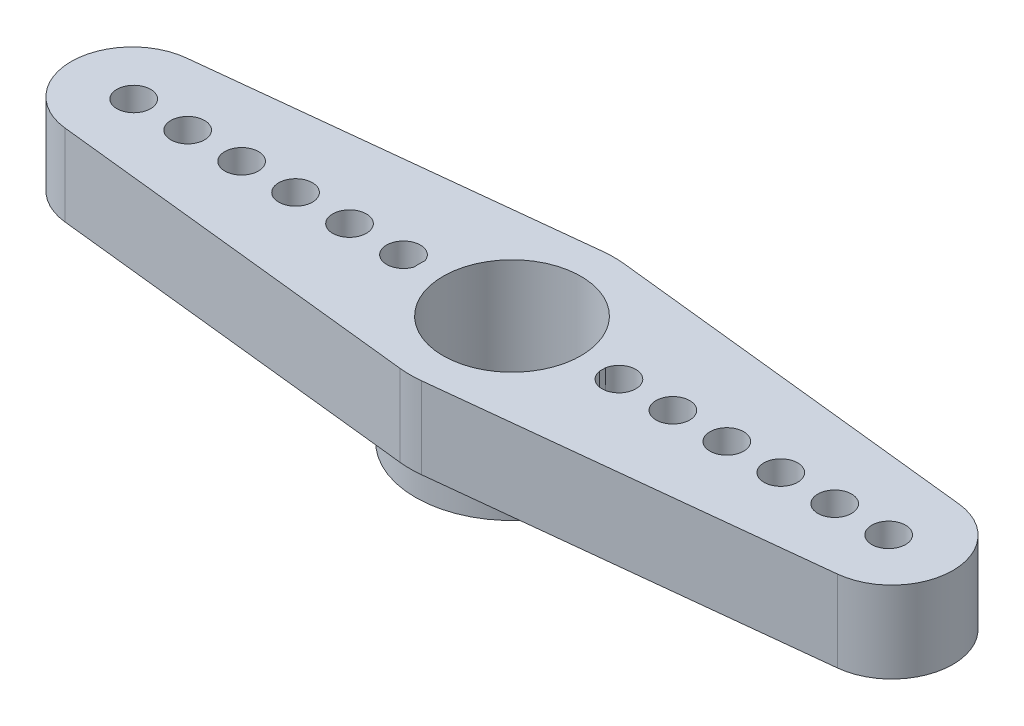
ISO-10303-21;
HEADER;
FILE_DESCRIPTION(('STEP AP214'),'2;1');
FILE_NAME('part.step','',(''),(''),'','','');
FILE_SCHEMA(('AUTOMOTIVE_DESIGN { 1 0 10303 214 1 1 1 1 }'));
ENDSEC;
DATA;
#1=APPLICATION_CONTEXT('core data for automotive mechanical design processes');
#2=APPLICATION_PROTOCOL_DEFINITION('international standard','automotive_design',2000,#1);
#3=PRODUCT_CONTEXT('',#1,'mechanical');
#4=PRODUCT('Part','Part','',(#3));
#5=PRODUCT_RELATED_PRODUCT_CATEGORY('part','',(#4));
#6=PRODUCT_DEFINITION_FORMATION('','',#4);
#7=PRODUCT_DEFINITION_CONTEXT('part definition',#1,'design');
#8=PRODUCT_DEFINITION('design','',#6,#7);
#9=PRODUCT_DEFINITION_SHAPE('','',#8);
#10=(LENGTH_UNIT() NAMED_UNIT(*) SI_UNIT(.MILLI.,.METRE.));
#11=(NAMED_UNIT(*) PLANE_ANGLE_UNIT() SI_UNIT($,.RADIAN.));
#12=(NAMED_UNIT(*) SI_UNIT($,.STERADIAN.) SOLID_ANGLE_UNIT());
#13=UNCERTAINTY_MEASURE_WITH_UNIT(LENGTH_MEASURE(1.E-05),#10,'distance_accuracy_value','');
#14=(GEOMETRIC_REPRESENTATION_CONTEXT(3) GLOBAL_UNCERTAINTY_ASSIGNED_CONTEXT((#13)) GLOBAL_UNIT_ASSIGNED_CONTEXT((#10,
#11,#12)) REPRESENTATION_CONTEXT('',''));
#15=CARTESIAN_POINT('',(0.,0.,0.));
#16=DIRECTION('',(0.,0.,1.));
#17=DIRECTION('',(1.,0.,0.));
#18=AXIS2_PLACEMENT_3D('',#15,#16,#17);
#19=CARTESIAN_POINT('',(-0.719755307054941,6.301994,-4.01353641249462));
#20=DIRECTION('',(0.,-1.,0.));
#21=DIRECTION('',(0.,0.,-1.));
#22=AXIS2_PLACEMENT_3D('',#19,#20,#21);
#23=CYLINDRICAL_SURFACE('',#22,3.3750823447217);
#24=CARTESIAN_POINT('',(-0.719755307054941,2.999994,-4.01353641249462));
#25=DIRECTION('',(0.,1.,0.));
#26=DIRECTION('',(0.,0.,1.));
#27=AXIS2_PLACEMENT_3D('',#24,#25,#26);
#28=CIRCLE('',#27,3.3750823447217);
#29=CARTESIAN_POINT('',(2.65230837761976,2.999994,-3.87082222206423));
#30=VERTEX_POINT('',#29);
#31=CARTESIAN_POINT('',(2.65458090260484,2.999994,-4.08450103629411));
#32=VERTEX_POINT('',#31);
#33=EDGE_CURVE('E165',#30,#32,#28,.T.);
#34=ORIENTED_EDGE('',*,*,#33,.F.);
#35=DIRECTION('',(0.,1.,0.));
#36=VECTOR('',#35,1.);
#37=CARTESIAN_POINT('',(2.65230837761976,-1.016,-3.87082222206425));
#38=LINE('',#37,#36);
#39=CARTESIAN_POINT('',(2.65230837761976,-1.016,-3.87082222206425));
#40=VERTEX_POINT('',#39);
#41=EDGE_CURVE('E67',#40,#30,#38,.T.);
#42=ORIENTED_EDGE('',*,*,#41,.F.);
#43=CARTESIAN_POINT('',(-0.719755307054941,-1.016,-4.01353641249462));
#44=DIRECTION('',(0.,1.,0.));
#45=DIRECTION('',(0.,0.,1.));
#46=AXIS2_PLACEMENT_3D('',#43,#44,#45);
#47=CIRCLE('',#46,3.3750823447217);
#48=CARTESIAN_POINT('',(2.65458090260484,-1.016,-4.0845010362941));
#49=VERTEX_POINT('',#48);
#50=EDGE_CURVE('E760',#49,#40,#47,.F.);
#51=ORIENTED_EDGE('',*,*,#50,.F.);
#52=DIRECTION('',(0.,1.,0.));
#53=VECTOR('',#52,1.);
#54=CARTESIAN_POINT('',(2.65458090260484,-1.016,-4.0845010362941));
#55=LINE('',#54,#53);
#56=EDGE_CURVE('E166',#49,#32,#55,.T.);
#57=ORIENTED_EDGE('',*,*,#56,.T.);
#58=EDGE_LOOP('',(#34,#42,#51,#57));
#59=FACE_BOUND('',#58,.T.);
#60=ADVANCED_FACE('F49',(#59),#23,.T.);
#61=CARTESIAN_POINT('',(-4.0906830412267,2.999994,-4.18094920962743));
#62=VERTEX_POINT('',#61);
#63=CARTESIAN_POINT('',(-4.08632212471416,2.999994,-3.77393529420009));
#64=VERTEX_POINT('',#63);
#65=EDGE_CURVE('E172',#62,#64,#28,.T.);
#66=ORIENTED_EDGE('',*,*,#65,.F.);
#67=DIRECTION('',(0.,1.,0.));
#68=VECTOR('',#67,1.);
#69=CARTESIAN_POINT('',(-4.0906830412267,-1.016,-4.18094920962742));
#70=LINE('',#69,#68);
#71=CARTESIAN_POINT('',(-4.0906830412267,-1.016,-4.18094920962742));
#72=VERTEX_POINT('',#71);
#73=EDGE_CURVE('E732',#72,#62,#70,.T.);
#74=ORIENTED_EDGE('',*,*,#73,.F.);
#75=CARTESIAN_POINT('',(-0.719755307054941,-1.016,-4.01353641249462));
#76=DIRECTION('',(0.,1.,0.));
#77=DIRECTION('',(0.,0.,1.));
#78=AXIS2_PLACEMENT_3D('',#75,#76,#77);
#79=CIRCLE('',#78,3.3750823447217);
#80=CARTESIAN_POINT('',(-4.08632212471416,-1.016,-3.77393529420009));
#81=VERTEX_POINT('',#80);
#82=EDGE_CURVE('E179',#81,#72,#79,.F.);
#83=ORIENTED_EDGE('',*,*,#82,.F.);
#84=DIRECTION('',(0.,1.,0.));
#85=VECTOR('',#84,1.);
#86=CARTESIAN_POINT('',(-4.08632212471416,-1.016,-3.77393529420009));
#87=LINE('',#86,#85);
#88=EDGE_CURVE('E736',#81,#64,#87,.T.);
#89=ORIENTED_EDGE('',*,*,#88,.T.);
#90=EDGE_LOOP('',(#66,#74,#83,#89));
#91=FACE_BOUND('',#90,.T.);
#92=ADVANCED_FACE('F368',(#91),#23,.T.);
#93=CARTESIAN_POINT('',(-0.719755533385708,0.,-4.03375521093414));
#94=DIRECTION('',(0.,-1.,0.));
#95=DIRECTION('',(0.,0.,-1.));
#96=AXIS2_PLACEMENT_3D('',#93,#94,#95);
#97=PLANE('',#96);
#98=CARTESIAN_POINT('',(-8.65322302171259,0.,-3.970614789235));
#99=DIRECTION('',(0.,-1.,0.));
#100=DIRECTION('',(0.,0.,-1.));
#101=AXIS2_PLACEMENT_3D('',#98,#99,#100);
#102=CIRCLE('',#101,0.621776251999999);
#103=CARTESIAN_POINT('',(-8.65322302171259,0.,-4.592391041235));
#104=VERTEX_POINT('',#103);
#105=EDGE_CURVE('E53',#104,#104,#102,.T.);
#106=ORIENTED_EDGE('',*,*,#105,.F.);
#107=EDGE_LOOP('',(#106));
#108=FACE_BOUND('',#107,.T.);
#109=CARTESIAN_POINT('',(-10.6418375357126,0.,-3.97061478923498));
#110=DIRECTION('',(0.,-1.,0.));
#111=DIRECTION('',(0.,0.,-1.));
#112=AXIS2_PLACEMENT_3D('',#109,#110,#111);
#113=CIRCLE('',#112,0.621776251999999);
#114=CARTESIAN_POINT('',(-10.6418375357126,0.,-4.59239104123498));
#115=VERTEX_POINT('',#114);
#116=EDGE_CURVE('E234',#115,#115,#113,.T.);
#117=ORIENTED_EDGE('',*,*,#116,.F.);
#118=EDGE_LOOP('',(#117));
#119=FACE_BOUND('',#118,.T.);
#120=CARTESIAN_POINT('',(-12.6304520497126,0.,-3.97061478923497));
#121=DIRECTION('',(0.,-1.,0.));
#122=DIRECTION('',(0.,0.,-1.));
#123=AXIS2_PLACEMENT_3D('',#120,#121,#122);
#124=CIRCLE('',#123,0.621776251999999);
#125=CARTESIAN_POINT('',(-12.6304520497126,0.,-4.59239104123497));
#126=VERTEX_POINT('',#125);
#127=EDGE_CURVE('E229',#126,#126,#124,.T.);
#128=ORIENTED_EDGE('',*,*,#127,.F.);
#129=EDGE_LOOP('',(#128));
#130=FACE_BOUND('',#129,.T.);
#131=CARTESIAN_POINT('',(-14.6190665637126,0.,-3.97061478923496));
#132=DIRECTION('',(0.,-1.,0.));
#133=DIRECTION('',(0.,0.,-1.));
#134=AXIS2_PLACEMENT_3D('',#131,#132,#133);
#135=CIRCLE('',#134,0.621776251999999);
#136=CARTESIAN_POINT('',(-14.6190665637126,0.,-4.59239104123496));
#137=VERTEX_POINT('',#136);
#138=EDGE_CURVE('E224',#137,#137,#135,.T.);
#139=ORIENTED_EDGE('',*,*,#138,.F.);
#140=EDGE_LOOP('',(#139));
#141=FACE_BOUND('',#140,.T.);
#142=CARTESIAN_POINT('',(7.24316630490026,0.,-3.970614789235));
#143=DIRECTION('',(0.,-1.,0.));
#144=DIRECTION('',(0.,0.,-1.));
#145=AXIS2_PLACEMENT_3D('',#142,#143,#144);
#146=CIRCLE('',#145,0.621776252000001);
#147=CARTESIAN_POINT('',(7.24316630490026,0.,-4.592391041235));
#148=VERTEX_POINT('',#147);
#149=EDGE_CURVE('E214',#148,#148,#146,.F.);
#150=ORIENTED_EDGE('',*,*,#149,.T.);
#151=EDGE_LOOP('',(#150));
#152=FACE_BOUND('',#151,.T.);
#153=CARTESIAN_POINT('',(11.2203953329003,0.,-3.97061478923497));
#154=DIRECTION('',(0.,-1.,0.));
#155=DIRECTION('',(0.,0.,-1.));
#156=AXIS2_PLACEMENT_3D('',#153,#154,#155);
#157=CIRCLE('',#156,0.621776251999999);
#158=CARTESIAN_POINT('',(11.2203953329003,0.,-4.59239104123497));
#159=VERTEX_POINT('',#158);
#160=EDGE_CURVE('E204',#159,#159,#157,.F.);
#161=ORIENTED_EDGE('',*,*,#160,.T.);
#162=EDGE_LOOP('',(#161));
#163=FACE_BOUND('',#162,.T.);
#164=CARTESIAN_POINT('',(-0.719755533385708,0.,-4.03375521093414));
#165=DIRECTION('',(0.,1.,0.));
#166=DIRECTION('',(0.,0.,-1.));
#167=AXIS2_PLACEMENT_3D('',#164,#165,#166);
#168=CIRCLE('',#167,3.73659729971613);
#169=CARTESIAN_POINT('',(-0.317978333385708,0.,-7.74868918905623));
#170=VERTEX_POINT('',#169);
#171=CARTESIAN_POINT('',(-1.12153273338571,0.,-7.74868918905623));
#172=VERTEX_POINT('',#171);
#173=EDGE_CURVE('E280',#170,#172,#168,.T.);
#174=ORIENTED_EDGE('',*,*,#173,.F.);
#175=DIRECTION('',(-0.994202393285548,0.,-0.107524886353294));
#176=VECTOR('',#175,1.);
#177=CARTESIAN_POINT('',(13.5213132666143,0.,-6.25194338905623));
#178=LINE('',#177,#176);
#179=CARTESIAN_POINT('',(13.5213132666143,0.,-6.25194338905623));
#180=VERTEX_POINT('',#179);
#181=EDGE_CURVE('E258',#180,#170,#178,.T.);
#182=ORIENTED_EDGE('',*,*,#181,.F.);
#183=CARTESIAN_POINT('',(13.2802404727299,0.,-4.01488918905623));
#184=DIRECTION('',(0.,1.,0.));
#185=DIRECTION('',(0.,0.,-1.));
#186=AXIS2_PLACEMENT_3D('',#183,#184,#185);
#187=CIRCLE('',#186,2.25000613014473);
#188=CARTESIAN_POINT('',(13.5213132666143,0.,-1.77783498905622));
#189=VERTEX_POINT('',#188);
#190=EDGE_CURVE('E299',#189,#180,#187,.T.);
#191=ORIENTED_EDGE('',*,*,#190,.F.);
#192=DIRECTION('',(0.994202393285548,0.,-0.107524886353294));
#193=VECTOR('',#192,1.);
#194=CARTESIAN_POINT('',(13.5213132666143,0.,-1.77783498905622));
#195=LINE('',#194,#193);
#196=CARTESIAN_POINT('',(-0.317978333385709,0.,-0.281089189056225));
#197=VERTEX_POINT('',#196);
#198=EDGE_CURVE('E296',#197,#189,#195,.T.);
#199=ORIENTED_EDGE('',*,*,#198,.F.);
#200=CARTESIAN_POINT('',(-0.719755533385708,0.,-3.99602316717831));
#201=DIRECTION('',(0.,1.,0.));
#202=DIRECTION('',(0.,0.,1.));
#203=AXIS2_PLACEMENT_3D('',#200,#201,#202);
#204=CIRCLE('',#203,3.73659729971613);
#205=CARTESIAN_POINT('',(-1.12153273338571,0.,-0.281089189056225));
#206=VERTEX_POINT('',#205);
#207=EDGE_CURVE('E293',#206,#197,#204,.T.);
#208=ORIENTED_EDGE('',*,*,#207,.F.);
#209=DIRECTION('',(0.994202393285548,0.,0.107524886353294));
#210=VECTOR('',#209,1.);
#211=CARTESIAN_POINT('',(-14.9608243333857,0.,-1.77783498905622));
#212=LINE('',#211,#210);
#213=CARTESIAN_POINT('',(-14.9608243333857,0.,-1.77783498905623));
#214=VERTEX_POINT('',#213);
#215=EDGE_CURVE('E290',#214,#206,#212,.T.);
#216=ORIENTED_EDGE('',*,*,#215,.F.);
#217=CARTESIAN_POINT('',(-14.7197515395013,0.,-4.01488918905623));
#218=DIRECTION('',(0.,1.,0.));
#219=DIRECTION('',(0.,0.,1.));
#220=AXIS2_PLACEMENT_3D('',#217,#218,#219);
#221=CIRCLE('',#220,2.25000613014473);
#222=CARTESIAN_POINT('',(-14.9608243333857,0.,-6.25194338905623));
#223=VERTEX_POINT('',#222);
#224=EDGE_CURVE('E287',#223,#214,#221,.T.);
#225=ORIENTED_EDGE('',*,*,#224,.F.);
#226=DIRECTION('',(-0.994202393285548,0.,0.107524886353294));
#227=VECTOR('',#226,1.);
#228=CARTESIAN_POINT('',(-14.9608243333857,0.,-6.25194338905623));
#229=LINE('',#228,#227);
#230=EDGE_CURVE('E284',#172,#223,#229,.T.);
#231=ORIENTED_EDGE('',*,*,#230,.F.);
#232=EDGE_LOOP('',(#174,#182,#191,#199,#208,#216,#225,#231));
#233=FACE_BOUND('',#232,.T.);
#234=CARTESIAN_POINT('',(-6.66460850771259,0.,-3.97061478923501));
#235=DIRECTION('',(0.,-1.,0.));
#236=DIRECTION('',(0.,0.,-1.));
#237=AXIS2_PLACEMENT_3D('',#234,#235,#236);
#238=CIRCLE('',#237,0.621776251999999);
#239=CARTESIAN_POINT('',(-6.66460850771259,0.,-4.59239104123501));
#240=VERTEX_POINT('',#239);
#241=EDGE_CURVE('E184',#240,#240,#238,.T.);
#242=ORIENTED_EDGE('',*,*,#241,.F.);
#243=EDGE_LOOP('',(#242));
#244=FACE_BOUND('',#243,.T.);
#245=CARTESIAN_POINT('',(9.23178081890026,0.,-3.97061478923498));
#246=DIRECTION('',(0.,-1.,0.));
#247=DIRECTION('',(0.,0.,-1.));
#248=AXIS2_PLACEMENT_3D('',#245,#246,#247);
#249=CIRCLE('',#248,0.621776251999999);
#250=CARTESIAN_POINT('',(9.23178081890026,0.,-4.59239104123498));
#251=VERTEX_POINT('',#250);
#252=EDGE_CURVE('E199',#251,#251,#249,.F.);
#253=ORIENTED_EDGE('',*,*,#252,.T.);
#254=EDGE_LOOP('',(#253));
#255=FACE_BOUND('',#254,.T.);
#256=CARTESIAN_POINT('',(13.2090098469003,0.,-3.97061478923496));
#257=DIRECTION('',(0.,-1.,0.));
#258=DIRECTION('',(0.,0.,-1.));
#259=AXIS2_PLACEMENT_3D('',#256,#257,#258);
#260=CIRCLE('',#259,0.621776251999999);
#261=CARTESIAN_POINT('',(13.2090098469003,0.,-4.59239104123496));
#262=VERTEX_POINT('',#261);
#263=EDGE_CURVE('E209',#262,#262,#260,.F.);
#264=ORIENTED_EDGE('',*,*,#263,.T.);
#265=EDGE_LOOP('',(#264));
#266=FACE_BOUND('',#265,.T.);
#267=CARTESIAN_POINT('',(5.25455179090026,0.,-3.97061478923501));
#268=DIRECTION('',(0.,-1.,0.));
#269=DIRECTION('',(0.,0.,-1.));
#270=AXIS2_PLACEMENT_3D('',#267,#268,#269);
#271=CIRCLE('',#270,0.621776251999999);
#272=CARTESIAN_POINT('',(5.25455179090026,0.,-4.59239104123501));
#273=VERTEX_POINT('',#272);
#274=EDGE_CURVE('E219',#273,#273,#271,.F.);
#275=ORIENTED_EDGE('',*,*,#274,.T.);
#276=EDGE_LOOP('',(#275));
#277=FACE_BOUND('',#276,.T.);
#278=CARTESIAN_POINT('',(-0.719799300150664,0.,-4.01491224896464));
#279=DIRECTION('',(0.,-1.,0.));
#280=DIRECTION('',(0.,0.,-1.));
#281=AXIS2_PLACEMENT_3D('',#278,#279,#280);
#282=CIRCLE('',#281,3.556);
#283=CARTESIAN_POINT('',(2.8060339474114,0.,-3.55270460040617));
#284=VERTEX_POINT('',#283);
#285=CARTESIAN_POINT('',(-4.24201186821214,0.,-3.52587786838415));
#286=VERTEX_POINT('',#285);
#287=EDGE_CURVE('E249',#284,#286,#282,.T.);
#288=ORIENTED_EDGE('',*,*,#287,.F.);
#289=CARTESIAN_POINT('',(3.26593735458067,0.,-3.97114762355899));
#290=DIRECTION('',(0.,-1.,0.));
#291=DIRECTION('',(0.,0.,-1.));
#292=AXIS2_PLACEMENT_3D('',#289,#290,#291);
#293=CIRCLE('',#292,0.621776251999999);
#294=CARTESIAN_POINT('',(2.81533299330576,0.,-4.39958830457703));
#295=VERTEX_POINT('',#294);
#296=EDGE_CURVE('E192',#284,#295,#293,.F.);
#297=ORIENTED_EDGE('',*,*,#296,.T.);
#298=CARTESIAN_POINT('',(-4.25196828447618,0.,-4.42590892312256));
#299=VERTEX_POINT('',#298);
#300=EDGE_CURVE('E243',#299,#295,#282,.T.);
#301=ORIENTED_EDGE('',*,*,#300,.F.);
#302=CARTESIAN_POINT('',(-4.67599407139299,0.,-3.97114762355899));
#303=DIRECTION('',(0.,-1.,0.));
#304=DIRECTION('',(0.,0.,-1.));
#305=AXIS2_PLACEMENT_3D('',#302,#303,#304);
#306=CIRCLE('',#305,0.621776252);
#307=EDGE_CURVE('E395',#286,#299,#306,.T.);
#308=ORIENTED_EDGE('',*,*,#307,.F.);
#309=EDGE_LOOP('',(#288,#297,#301,#308));
#310=FACE_BOUND('',#309,.T.);
#311=ADVANCED_FACE('F364',(#108,#119,#130,#141,#152,#163,#233,#244,#255,#266,#277,#310),#97,.T.);
#312=CARTESIAN_POINT('',(-0.719799300150664,-1.016,-4.01491224896464));
#313=DIRECTION('',(0.,1.,0.));
#314=DIRECTION('',(0.,0.,1.));
#315=AXIS2_PLACEMENT_3D('',#312,#313,#314);
#316=CYLINDRICAL_SURFACE('',#315,3.556);
#317=DIRECTION('',(0.,1.,0.));
#318=VECTOR('',#317,1.);
#319=CARTESIAN_POINT('',(2.81533299330576,2.642997,-4.39958830457703));
#320=LINE('',#319,#318);
#321=CARTESIAN_POINT('',(2.81533299330576,-1.016,-4.39958830457703));
#322=VERTEX_POINT('',#321);
#323=EDGE_CURVE('E185',#322,#295,#320,.T.);
#324=ORIENTED_EDGE('',*,*,#323,.F.);
#325=CARTESIAN_POINT('',(-0.719799300150664,-1.016,-4.01491224896464));
#326=DIRECTION('',(0.,-1.,0.));
#327=DIRECTION('',(0.,0.,-1.));
#328=AXIS2_PLACEMENT_3D('',#325,#326,#327);
#329=CIRCLE('',#328,3.556);
#330=CARTESIAN_POINT('',(-4.25196828447618,-1.016,-4.42590892312256));
#331=VERTEX_POINT('',#330);
#332=EDGE_CURVE('E244',#331,#322,#329,.T.);
#333=ORIENTED_EDGE('',*,*,#332,.F.);
#334=DIRECTION('',(0.,1.,0.));
#335=VECTOR('',#334,1.);
#336=CARTESIAN_POINT('',(-4.25196828447618,2.642997,-4.42590892312256));
#337=LINE('',#336,#335);
#338=EDGE_CURVE('E75',#331,#299,#337,.T.);
#339=ORIENTED_EDGE('',*,*,#338,.T.);
#340=ORIENTED_EDGE('',*,*,#300,.T.);
#341=EDGE_LOOP('',(#324,#333,#339,#340));
#342=FACE_BOUND('',#341,.T.);
#343=ADVANCED_FACE('F367',(#342),#316,.T.);
#344=DIRECTION('',(0.,1.,0.));
#345=VECTOR('',#344,1.);
#346=CARTESIAN_POINT('',(2.8060339474114,2.642997,-3.55270460040617));
#347=LINE('',#346,#345);
#348=CARTESIAN_POINT('',(2.8060339474114,-1.016,-3.55270460040617));
#349=VERTEX_POINT('',#348);
#350=EDGE_CURVE('E755',#284,#349,#347,.F.);
#351=ORIENTED_EDGE('',*,*,#350,.F.);
#352=ORIENTED_EDGE('',*,*,#287,.T.);
#353=DIRECTION('',(0.,1.,0.));
#354=VECTOR('',#353,1.);
#355=CARTESIAN_POINT('',(-4.24201186821214,2.642997,-3.52587786838415));
#356=LINE('',#355,#354);
#357=CARTESIAN_POINT('',(-4.24201186821214,-1.016,-3.52587786838415));
#358=VERTEX_POINT('',#357);
#359=EDGE_CURVE('E748',#286,#358,#356,.F.);
#360=ORIENTED_EDGE('',*,*,#359,.T.);
#361=EDGE_CURVE('E248',#349,#358,#329,.T.);
#362=ORIENTED_EDGE('',*,*,#361,.F.);
#363=EDGE_LOOP('',(#351,#352,#360,#362));
#364=FACE_BOUND('',#363,.T.);
#365=ADVANCED_FACE('F512',(#364),#316,.T.);
#366=CARTESIAN_POINT('',(0.,-1.016,0.));
#367=DIRECTION('',(0.,-1.,0.));
#368=DIRECTION('',(0.,0.,-1.));
#369=AXIS2_PLACEMENT_3D('',#366,#367,#368);
#370=PLANE('',#369);
#371=CARTESIAN_POINT('',(-0.719799300150664,-1.016,-4.01491224896464));
#372=DIRECTION('',(0.,1.,0.));
#373=DIRECTION('',(0.,0.,1.));
#374=AXIS2_PLACEMENT_3D('',#371,#372,#373);
#375=CIRCLE('',#374,2.54);
#376=CARTESIAN_POINT('',(-0.719799300150664,-1.016,-1.47491224896464));
#377=VERTEX_POINT('',#376);
#378=EDGE_CURVE('E764',#377,#377,#375,.T.);
#379=ORIENTED_EDGE('',*,*,#378,.T.);
#380=EDGE_LOOP('',(#379));
#381=FACE_BOUND('',#380,.T.);
#382=ORIENTED_EDGE('',*,*,#50,.T.);
#383=CARTESIAN_POINT('',(3.26593735458067,-1.016,-3.97114762355899));
#384=DIRECTION('',(0.,-1.,0.));
#385=DIRECTION('',(0.,0.,-1.));
#386=AXIS2_PLACEMENT_3D('',#383,#384,#385);
#387=CIRCLE('',#386,0.621776251999999);
#388=EDGE_CURVE('E12',#40,#349,#387,.F.);
#389=ORIENTED_EDGE('',*,*,#388,.T.);
#390=ORIENTED_EDGE('',*,*,#361,.T.);
#391=CARTESIAN_POINT('',(-4.67599407139299,-1.016,-3.97114762355899));
#392=DIRECTION('',(0.,-1.,0.));
#393=DIRECTION('',(0.,0.,-1.));
#394=AXIS2_PLACEMENT_3D('',#391,#392,#393);
#395=CIRCLE('',#394,0.621776252);
#396=EDGE_CURVE('E59',#81,#358,#395,.T.);
#397=ORIENTED_EDGE('',*,*,#396,.F.);
#398=ORIENTED_EDGE('',*,*,#82,.T.);
#399=CARTESIAN_POINT('',(-4.67599407139299,-1.016,-3.97114762355899));
#400=DIRECTION('',(0.,1.,0.));
#401=DIRECTION('',(0.,0.,1.));
#402=AXIS2_PLACEMENT_3D('',#399,#400,#401);
#403=CIRCLE('',#402,0.621776252);
#404=EDGE_CURVE('E727',#72,#331,#403,.T.);
#405=ORIENTED_EDGE('',*,*,#404,.T.);
#406=ORIENTED_EDGE('',*,*,#332,.T.);
#407=CARTESIAN_POINT('',(3.26593735458067,-1.016,-3.97114762355899));
#408=DIRECTION('',(0.,1.,0.));
#409=DIRECTION('',(0.,0.,1.));
#410=AXIS2_PLACEMENT_3D('',#407,#408,#409);
#411=CIRCLE('',#410,0.621776251999999);
#412=EDGE_CURVE('E171',#49,#322,#411,.F.);
#413=ORIENTED_EDGE('',*,*,#412,.F.);
#414=EDGE_LOOP('',(#382,#389,#390,#397,#398,#405,#406,#413));
#415=FACE_BOUND('',#414,.T.);
#416=ADVANCED_FACE('F489',(#381,#415),#370,.T.);
#417=CARTESIAN_POINT('',(-0.719755533385708,2.999994,-4.03375521093414));
#418=DIRECTION('',(0.,-1.,0.));
#419=DIRECTION('',(0.,0.,-1.));
#420=AXIS2_PLACEMENT_3D('',#417,#418,#419);
#421=CYLINDRICAL_SURFACE('',#420,3.73659729971613);
#422=ORIENTED_EDGE('',*,*,#173,.T.);
#423=DIRECTION('',(0.,-1.,0.));
#424=VECTOR('',#423,1.);
#425=CARTESIAN_POINT('',(-1.12153273338571,2.999994,-7.74868918905623));
#426=LINE('',#425,#424);
#427=CARTESIAN_POINT('',(-1.12153273338571,2.999994,-7.74868918905623));
#428=VERTEX_POINT('',#427);
#429=EDGE_CURVE('E331',#428,#172,#426,.T.);
#430=ORIENTED_EDGE('',*,*,#429,.F.);
#431=CARTESIAN_POINT('',(-0.719755533385708,2.999994,-4.03375521093414));
#432=DIRECTION('',(0.,1.,0.));
#433=DIRECTION('',(0.,0.,-1.));
#434=AXIS2_PLACEMENT_3D('',#431,#432,#433);
#435=CIRCLE('',#434,3.73659729971613);
#436=CARTESIAN_POINT('',(-0.317978333385708,2.999994,-7.74868918905623));
#437=VERTEX_POINT('',#436);
#438=EDGE_CURVE('E253',#437,#428,#435,.T.);
#439=ORIENTED_EDGE('',*,*,#438,.F.);
#440=DIRECTION('',(0.,-1.,0.));
#441=VECTOR('',#440,1.);
#442=CARTESIAN_POINT('',(-0.317978333385708,2.999994,-7.74868918905623));
#443=LINE('',#442,#441);
#444=EDGE_CURVE('E279',#437,#170,#443,.T.);
#445=ORIENTED_EDGE('',*,*,#444,.T.);
#446=EDGE_LOOP('',(#422,#430,#439,#445));
#447=FACE_BOUND('',#446,.T.);
#448=ADVANCED_FACE('F51',(#447),#421,.T.);
#449=CARTESIAN_POINT('',(-14.9608243333857,2.999994,-6.25194338905623));
#450=DIRECTION('',(0.107524886353294,0.,0.994202393285548));
#451=DIRECTION('',(0.994202393285548,0.,-0.107524886353294));
#452=AXIS2_PLACEMENT_3D('',#449,#450,#451);
#453=PLANE('',#452);
#454=ORIENTED_EDGE('',*,*,#230,.T.);
#455=DIRECTION('',(0.,-1.,0.));
#456=VECTOR('',#455,1.);
#457=CARTESIAN_POINT('',(-14.9608243333857,2.999994,-6.25194338905623));
#458=LINE('',#457,#456);
#459=CARTESIAN_POINT('',(-14.9608243333857,2.999994,-6.25194338905623));
#460=VERTEX_POINT('',#459);
#461=EDGE_CURVE('E327',#460,#223,#458,.T.);
#462=ORIENTED_EDGE('',*,*,#461,.F.);
#463=DIRECTION('',(-0.994202393285548,0.,0.107524886353294));
#464=VECTOR('',#463,1.);
#465=CARTESIAN_POINT('',(-14.9608243333857,2.999994,-6.25194338905623));
#466=LINE('',#465,#464);
#467=EDGE_CURVE('E257',#428,#460,#466,.T.);
#468=ORIENTED_EDGE('',*,*,#467,.F.);
#469=ORIENTED_EDGE('',*,*,#429,.T.);
#470=EDGE_LOOP('',(#454,#462,#468,#469));
#471=FACE_BOUND('',#470,.T.);
#472=ADVANCED_FACE('F482',(#471),#453,.F.);
#473=CARTESIAN_POINT('',(-14.7197515395013,2.999994,-4.01488918905623));
#474=DIRECTION('',(0.,-1.,0.));
#475=DIRECTION('',(0.,0.,-1.));
#476=AXIS2_PLACEMENT_3D('',#473,#474,#475);
#477=CYLINDRICAL_SURFACE('',#476,2.25000613014473);
#478=ORIENTED_EDGE('',*,*,#224,.T.);
#479=DIRECTION('',(0.,-1.,0.));
#480=VECTOR('',#479,1.);
#481=CARTESIAN_POINT('',(-14.9608243333857,2.999994,-1.77783498905623));
#482=LINE('',#481,#480);
#483=CARTESIAN_POINT('',(-14.9608243333857,2.999994,-1.77783498905623));
#484=VERTEX_POINT('',#483);
#485=EDGE_CURVE('E323',#484,#214,#482,.T.);
#486=ORIENTED_EDGE('',*,*,#485,.F.);
#487=CARTESIAN_POINT('',(-14.7197515395013,2.999994,-4.01488918905623));
#488=DIRECTION('',(0.,1.,0.));
#489=DIRECTION('',(0.,0.,1.));
#490=AXIS2_PLACEMENT_3D('',#487,#488,#489);
#491=CIRCLE('',#490,2.25000613014473);
#492=EDGE_CURVE('E261',#460,#484,#491,.T.);
#493=ORIENTED_EDGE('',*,*,#492,.F.);
#494=ORIENTED_EDGE('',*,*,#461,.T.);
#495=EDGE_LOOP('',(#478,#486,#493,#494));
#496=FACE_BOUND('',#495,.T.);
#497=ADVANCED_FACE('F479',(#496),#477,.T.);
#498=CARTESIAN_POINT('',(-14.9608243333857,2.999994,-1.77783498905622));
#499=DIRECTION('',(0.107524886353294,0.,-0.994202393285548));
#500=DIRECTION('',(-0.994202393285548,0.,-0.107524886353294));
#501=AXIS2_PLACEMENT_3D('',#498,#499,#500);
#502=PLANE('',#501);
#503=ORIENTED_EDGE('',*,*,#215,.T.);
#504=DIRECTION('',(0.,-1.,0.));
#505=VECTOR('',#504,1.);
#506=CARTESIAN_POINT('',(-1.12153273338571,2.999994,-0.281089189056225));
#507=LINE('',#506,#505);
#508=CARTESIAN_POINT('',(-1.12153273338571,2.999994,-0.281089189056225));
#509=VERTEX_POINT('',#508);
#510=EDGE_CURVE('E319',#509,#206,#507,.T.);
#511=ORIENTED_EDGE('',*,*,#510,.F.);
#512=DIRECTION('',(0.994202393285548,0.,0.107524886353294));
#513=VECTOR('',#512,1.);
#514=CARTESIAN_POINT('',(-14.9608243333857,2.999994,-1.77783498905622));
#515=LINE('',#514,#513);
#516=EDGE_CURVE('E264',#484,#509,#515,.T.);
#517=ORIENTED_EDGE('',*,*,#516,.F.);
#518=ORIENTED_EDGE('',*,*,#485,.T.);
#519=EDGE_LOOP('',(#503,#511,#517,#518));
#520=FACE_BOUND('',#519,.T.);
#521=ADVANCED_FACE('F475',(#520),#502,.F.);
#522=CARTESIAN_POINT('',(-0.719755533385708,2.999994,-3.99602316717831));
#523=DIRECTION('',(0.,-1.,0.));
#524=DIRECTION('',(0.,0.,-1.));
#525=AXIS2_PLACEMENT_3D('',#522,#523,#524);
#526=CYLINDRICAL_SURFACE('',#525,3.73659729971613);
#527=ORIENTED_EDGE('',*,*,#207,.T.);
#528=DIRECTION('',(0.,-1.,0.));
#529=VECTOR('',#528,1.);
#530=CARTESIAN_POINT('',(-0.317978333385709,2.999994,-0.281089189056225));
#531=LINE('',#530,#529);
#532=CARTESIAN_POINT('',(-0.317978333385709,2.999994,-0.281089189056225));
#533=VERTEX_POINT('',#532);
#534=EDGE_CURVE('E315',#533,#197,#531,.T.);
#535=ORIENTED_EDGE('',*,*,#534,.F.);
#536=CARTESIAN_POINT('',(-0.719755533385708,2.999994,-3.99602316717831));
#537=DIRECTION('',(0.,1.,0.));
#538=DIRECTION('',(0.,0.,1.));
#539=AXIS2_PLACEMENT_3D('',#536,#537,#538);
#540=CIRCLE('',#539,3.73659729971613);
#541=EDGE_CURVE('E267',#509,#533,#540,.T.);
#542=ORIENTED_EDGE('',*,*,#541,.F.);
#543=ORIENTED_EDGE('',*,*,#510,.T.);
#544=EDGE_LOOP('',(#527,#535,#542,#543));
#545=FACE_BOUND('',#544,.T.);
#546=ADVANCED_FACE('F471',(#545),#526,.T.);
#547=CARTESIAN_POINT('',(13.5213132666143,2.999994,-1.77783498905622));
#548=DIRECTION('',(-0.107524886353294,0.,-0.994202393285548));
#549=DIRECTION('',(-0.994202393285548,0.,0.107524886353294));
#550=AXIS2_PLACEMENT_3D('',#547,#548,#549);
#551=PLANE('',#550);
#552=ORIENTED_EDGE('',*,*,#198,.T.);
#553=DIRECTION('',(0.,-1.,0.));
#554=VECTOR('',#553,1.);
#555=CARTESIAN_POINT('',(13.5213132666143,2.999994,-1.77783498905622));
#556=LINE('',#555,#554);
#557=CARTESIAN_POINT('',(13.5213132666143,2.999994,-1.77783498905622));
#558=VERTEX_POINT('',#557);
#559=EDGE_CURVE('E311',#558,#189,#556,.T.);
#560=ORIENTED_EDGE('',*,*,#559,.F.);
#561=DIRECTION('',(0.994202393285548,0.,-0.107524886353294));
#562=VECTOR('',#561,1.);
#563=CARTESIAN_POINT('',(13.5213132666143,2.999994,-1.77783498905622));
#564=LINE('',#563,#562);
#565=EDGE_CURVE('E270',#533,#558,#564,.T.);
#566=ORIENTED_EDGE('',*,*,#565,.F.);
#567=ORIENTED_EDGE('',*,*,#534,.T.);
#568=EDGE_LOOP('',(#552,#560,#566,#567));
#569=FACE_BOUND('',#568,.T.);
#570=ADVANCED_FACE('F467',(#569),#551,.F.);
#571=CARTESIAN_POINT('',(13.2802404727299,2.999994,-4.01488918905623));
#572=DIRECTION('',(0.,-1.,0.));
#573=DIRECTION('',(0.,0.,-1.));
#574=AXIS2_PLACEMENT_3D('',#571,#572,#573);
#575=CYLINDRICAL_SURFACE('',#574,2.25000613014473);
#576=ORIENTED_EDGE('',*,*,#190,.T.);
#577=DIRECTION('',(0.,-1.,0.));
#578=VECTOR('',#577,1.);
#579=CARTESIAN_POINT('',(13.5213132666143,2.999994,-6.25194338905623));
#580=LINE('',#579,#578);
#581=CARTESIAN_POINT('',(13.5213132666143,2.999994,-6.25194338905623));
#582=VERTEX_POINT('',#581);
#583=EDGE_CURVE('E307',#582,#180,#580,.T.);
#584=ORIENTED_EDGE('',*,*,#583,.F.);
#585=CARTESIAN_POINT('',(13.2802404727299,2.999994,-4.01488918905623));
#586=DIRECTION('',(0.,1.,0.));
#587=DIRECTION('',(0.,0.,-1.));
#588=AXIS2_PLACEMENT_3D('',#585,#586,#587);
#589=CIRCLE('',#588,2.25000613014473);
#590=EDGE_CURVE('E273',#558,#582,#589,.T.);
#591=ORIENTED_EDGE('',*,*,#590,.F.);
#592=ORIENTED_EDGE('',*,*,#559,.T.);
#593=EDGE_LOOP('',(#576,#584,#591,#592));
#594=FACE_BOUND('',#593,.T.);
#595=ADVANCED_FACE('F463',(#594),#575,.T.);
#596=CARTESIAN_POINT('',(13.5213132666143,2.999994,-6.25194338905623));
#597=DIRECTION('',(-0.107524886353294,0.,0.994202393285548));
#598=DIRECTION('',(0.994202393285548,0.,0.107524886353294));
#599=AXIS2_PLACEMENT_3D('',#596,#597,#598);
#600=PLANE('',#599);
#601=ORIENTED_EDGE('',*,*,#181,.T.);
#602=ORIENTED_EDGE('',*,*,#444,.F.);
#603=DIRECTION('',(-0.994202393285548,0.,-0.107524886353294));
#604=VECTOR('',#603,1.);
#605=CARTESIAN_POINT('',(13.5213132666143,2.999994,-6.25194338905623));
#606=LINE('',#605,#604);
#607=EDGE_CURVE('E276',#582,#437,#606,.T.);
#608=ORIENTED_EDGE('',*,*,#607,.F.);
#609=ORIENTED_EDGE('',*,*,#583,.T.);
#610=EDGE_LOOP('',(#601,#602,#608,#609));
#611=FACE_BOUND('',#610,.T.);
#612=ADVANCED_FACE('F414',(#611),#600,.F.);
#613=CARTESIAN_POINT('',(-0.719755533385708,2.999994,-4.03375521093414));
#614=DIRECTION('',(0.,-1.,0.));
#615=DIRECTION('',(0.,0.,-1.));
#616=AXIS2_PLACEMENT_3D('',#613,#614,#615);
#617=PLANE('',#616);
#618=CARTESIAN_POINT('',(-0.719799300150664,2.999994,-4.01491224896464));
#619=DIRECTION('',(0.,1.,0.));
#620=DIRECTION('',(0.,0.,1.));
#621=AXIS2_PLACEMENT_3D('',#618,#619,#620);
#622=CIRCLE('',#621,2.54);
#623=CARTESIAN_POINT('',(-0.719799300150664,2.999994,-1.47491224896464));
#624=VERTEX_POINT('',#623);
#625=EDGE_CURVE('E766',#624,#624,#622,.T.);
#626=ORIENTED_EDGE('',*,*,#625,.F.);
#627=EDGE_LOOP('',(#626));
#628=FACE_BOUND('',#627,.T.);
#629=CARTESIAN_POINT('',(-4.67599407139299,2.999994,-3.97114762355899));
#630=DIRECTION('',(0.,-1.,0.));
#631=DIRECTION('',(0.,0.,-1.));
#632=AXIS2_PLACEMENT_3D('',#629,#630,#631);
#633=CIRCLE('',#632,0.621776252);
#634=EDGE_CURVE('E751',#64,#62,#633,.T.);
#635=ORIENTED_EDGE('',*,*,#634,.T.);
#636=ORIENTED_EDGE('',*,*,#65,.T.);
#637=EDGE_LOOP('',(#635,#636));
#638=FACE_BOUND('',#637,.T.);
#639=ORIENTED_EDGE('',*,*,#33,.T.);
#640=CARTESIAN_POINT('',(3.26593735458067,2.999994,-3.97114762355899));
#641=DIRECTION('',(0.,-1.,0.));
#642=DIRECTION('',(0.,0.,-1.));
#643=AXIS2_PLACEMENT_3D('',#640,#641,#642);
#644=CIRCLE('',#643,0.621776251999999);
#645=EDGE_CURVE('E176',#30,#32,#644,.F.);
#646=ORIENTED_EDGE('',*,*,#645,.F.);
#647=EDGE_LOOP('',(#639,#646));
#648=FACE_BOUND('',#647,.T.);
#649=CARTESIAN_POINT('',(-8.65322302171259,2.999994,-3.970614789235));
#650=DIRECTION('',(0.,-1.,0.));
#651=DIRECTION('',(0.,0.,-1.));
#652=AXIS2_PLACEMENT_3D('',#649,#650,#651);
#653=CIRCLE('',#652,0.621776251999999);
#654=CARTESIAN_POINT('',(-8.65322302171259,2.999994,-4.592391041235));
#655=VERTEX_POINT('',#654);
#656=EDGE_CURVE('E239',#655,#655,#653,.T.);
#657=ORIENTED_EDGE('',*,*,#656,.T.);
#658=EDGE_LOOP('',(#657));
#659=FACE_BOUND('',#658,.T.);
#660=CARTESIAN_POINT('',(-10.6418375357126,2.999994,-3.97061478923498));
#661=DIRECTION('',(0.,-1.,0.));
#662=DIRECTION('',(0.,0.,-1.));
#663=AXIS2_PLACEMENT_3D('',#660,#661,#662);
#664=CIRCLE('',#663,0.621776251999999);
#665=CARTESIAN_POINT('',(-10.6418375357126,2.999994,-4.59239104123498));
#666=VERTEX_POINT('',#665);
#667=EDGE_CURVE('E235',#666,#666,#664,.T.);
#668=ORIENTED_EDGE('',*,*,#667,.T.);
#669=EDGE_LOOP('',(#668));
#670=FACE_BOUND('',#669,.T.);
#671=CARTESIAN_POINT('',(-12.6304520497126,2.999994,-3.97061478923497));
#672=DIRECTION('',(0.,-1.,0.));
#673=DIRECTION('',(0.,0.,-1.));
#674=AXIS2_PLACEMENT_3D('',#671,#672,#673);
#675=CIRCLE('',#674,0.621776251999999);
#676=CARTESIAN_POINT('',(-12.6304520497126,2.999994,-4.59239104123497));
#677=VERTEX_POINT('',#676);
#678=EDGE_CURVE('E230',#677,#677,#675,.T.);
#679=ORIENTED_EDGE('',*,*,#678,.T.);
#680=EDGE_LOOP('',(#679));
#681=FACE_BOUND('',#680,.T.);
#682=CARTESIAN_POINT('',(-14.6190665637126,2.999994,-3.97061478923496));
#683=DIRECTION('',(0.,-1.,0.));
#684=DIRECTION('',(0.,0.,-1.));
#685=AXIS2_PLACEMENT_3D('',#682,#683,#684);
#686=CIRCLE('',#685,0.621776251999999);
#687=CARTESIAN_POINT('',(-14.6190665637126,2.999994,-4.59239104123496));
#688=VERTEX_POINT('',#687);
#689=EDGE_CURVE('E225',#688,#688,#686,.T.);
#690=ORIENTED_EDGE('',*,*,#689,.T.);
#691=EDGE_LOOP('',(#690));
#692=FACE_BOUND('',#691,.T.);
#693=CARTESIAN_POINT('',(5.25455179090026,2.999994,-3.97061478923501));
#694=DIRECTION('',(0.,-1.,0.));
#695=DIRECTION('',(0.,0.,-1.));
#696=AXIS2_PLACEMENT_3D('',#693,#694,#695);
#697=CIRCLE('',#696,0.621776251999999);
#698=CARTESIAN_POINT('',(5.25455179090026,2.999994,-4.59239104123501));
#699=VERTEX_POINT('',#698);
#700=EDGE_CURVE('E220',#699,#699,#697,.F.);
#701=ORIENTED_EDGE('',*,*,#700,.F.);
#702=EDGE_LOOP('',(#701));
#703=FACE_BOUND('',#702,.T.);
#704=CARTESIAN_POINT('',(7.24316630490026,2.999994,-3.970614789235));
#705=DIRECTION('',(0.,-1.,0.));
#706=DIRECTION('',(0.,0.,-1.));
#707=AXIS2_PLACEMENT_3D('',#704,#705,#706);
#708=CIRCLE('',#707,0.621776252000001);
#709=CARTESIAN_POINT('',(7.24316630490026,2.999994,-4.592391041235));
#710=VERTEX_POINT('',#709);
#711=EDGE_CURVE('E215',#710,#710,#708,.F.);
#712=ORIENTED_EDGE('',*,*,#711,.F.);
#713=EDGE_LOOP('',(#712));
#714=FACE_BOUND('',#713,.T.);
#715=CARTESIAN_POINT('',(13.2090098469003,2.999994,-3.97061478923496));
#716=DIRECTION('',(0.,-1.,0.));
#717=DIRECTION('',(0.,0.,-1.));
#718=AXIS2_PLACEMENT_3D('',#715,#716,#717);
#719=CIRCLE('',#718,0.621776251999999);
#720=CARTESIAN_POINT('',(13.2090098469003,2.999994,-4.59239104123496));
#721=VERTEX_POINT('',#720);
#722=EDGE_CURVE('E210',#721,#721,#719,.F.);
#723=ORIENTED_EDGE('',*,*,#722,.F.);
#724=EDGE_LOOP('',(#723));
#725=FACE_BOUND('',#724,.T.);
#726=CARTESIAN_POINT('',(11.2203953329003,2.999994,-3.97061478923497));
#727=DIRECTION('',(0.,-1.,0.));
#728=DIRECTION('',(0.,0.,-1.));
#729=AXIS2_PLACEMENT_3D('',#726,#727,#728);
#730=CIRCLE('',#729,0.621776251999999);
#731=CARTESIAN_POINT('',(11.2203953329003,2.999994,-4.59239104123497));
#732=VERTEX_POINT('',#731);
#733=EDGE_CURVE('E205',#732,#732,#730,.F.);
#734=ORIENTED_EDGE('',*,*,#733,.F.);
#735=EDGE_LOOP('',(#734));
#736=FACE_BOUND('',#735,.T.);
#737=CARTESIAN_POINT('',(9.23178081890026,2.999994,-3.97061478923498));
#738=DIRECTION('',(0.,-1.,0.));
#739=DIRECTION('',(0.,0.,-1.));
#740=AXIS2_PLACEMENT_3D('',#737,#738,#739);
#741=CIRCLE('',#740,0.621776251999999);
#742=CARTESIAN_POINT('',(9.23178081890026,2.999994,-4.59239104123498));
#743=VERTEX_POINT('',#742);
#744=EDGE_CURVE('E200',#743,#743,#741,.F.);
#745=ORIENTED_EDGE('',*,*,#744,.F.);
#746=EDGE_LOOP('',(#745));
#747=FACE_BOUND('',#746,.T.);
#748=ORIENTED_EDGE('',*,*,#438,.T.);
#749=ORIENTED_EDGE('',*,*,#467,.T.);
#750=ORIENTED_EDGE('',*,*,#492,.T.);
#751=ORIENTED_EDGE('',*,*,#516,.T.);
#752=ORIENTED_EDGE('',*,*,#541,.T.);
#753=ORIENTED_EDGE('',*,*,#565,.T.);
#754=ORIENTED_EDGE('',*,*,#590,.T.);
#755=ORIENTED_EDGE('',*,*,#607,.T.);
#756=EDGE_LOOP('',(#748,#749,#750,#751,#752,#753,#754,#755));
#757=FACE_BOUND('',#756,.T.);
#758=CARTESIAN_POINT('',(-6.66460850771259,2.999994,-3.97061478923501));
#759=DIRECTION('',(0.,-1.,0.));
#760=DIRECTION('',(0.,0.,-1.));
#761=AXIS2_PLACEMENT_3D('',#758,#759,#760);
#762=CIRCLE('',#761,0.621776251999999);
#763=CARTESIAN_POINT('',(-6.66460850771259,2.999994,-4.59239104123501));
#764=VERTEX_POINT('',#763);
#765=EDGE_CURVE('E190',#764,#764,#762,.T.);
#766=ORIENTED_EDGE('',*,*,#765,.T.);
#767=EDGE_LOOP('',(#766));
#768=FACE_BOUND('',#767,.T.);
#769=ADVANCED_FACE('F181',(#628,#638,#648,#659,#670,#681,#692,#703,#714,#725,#736,#747,#757,
#768),#617,.F.);
#770=CARTESIAN_POINT('',(-4.67599407139299,-1.016,-3.97114762355899));
#771=DIRECTION('',(0.,1.,0.));
#772=DIRECTION('',(0.,0.,1.));
#773=AXIS2_PLACEMENT_3D('',#770,#771,#772);
#774=CYLINDRICAL_SURFACE('',#773,0.621776252);
#775=ORIENTED_EDGE('',*,*,#88,.F.);
#776=ORIENTED_EDGE('',*,*,#396,.T.);
#777=ORIENTED_EDGE('',*,*,#359,.F.);
#778=ORIENTED_EDGE('',*,*,#307,.T.);
#779=ORIENTED_EDGE('',*,*,#338,.F.);
#780=ORIENTED_EDGE('',*,*,#404,.F.);
#781=ORIENTED_EDGE('',*,*,#73,.T.);
#782=ORIENTED_EDGE('',*,*,#634,.F.);
#783=EDGE_LOOP('',(#775,#776,#777,#778,#779,#780,#781,#782));
#784=FACE_BOUND('',#783,.T.);
#785=ADVANCED_FACE('F413',(#784),#774,.F.);
#786=CARTESIAN_POINT('',(3.26593735458067,-1.016,-3.97114762355899));
#787=DIRECTION('',(0.,1.,0.));
#788=DIRECTION('',(0.,0.,1.));
#789=AXIS2_PLACEMENT_3D('',#786,#787,#788);
#790=CYLINDRICAL_SURFACE('',#789,0.621776251999999);
#791=ORIENTED_EDGE('',*,*,#645,.T.);
#792=ORIENTED_EDGE('',*,*,#56,.F.);
#793=ORIENTED_EDGE('',*,*,#412,.T.);
#794=ORIENTED_EDGE('',*,*,#323,.T.);
#795=ORIENTED_EDGE('',*,*,#296,.F.);
#796=ORIENTED_EDGE('',*,*,#350,.T.);
#797=ORIENTED_EDGE('',*,*,#388,.F.);
#798=ORIENTED_EDGE('',*,*,#41,.T.);
#799=EDGE_LOOP('',(#791,#792,#793,#794,#795,#796,#797,#798));
#800=FACE_BOUND('',#799,.T.);
#801=ADVANCED_FACE('F175',(#800),#790,.F.);
#802=CARTESIAN_POINT('',(-6.66460850771259,-1.016,-3.97061478923501));
#803=DIRECTION('',(0.,1.,0.));
#804=DIRECTION('',(0.,0.,1.));
#805=AXIS2_PLACEMENT_3D('',#802,#803,#804);
#806=CYLINDRICAL_SURFACE('',#805,0.621776251999999);
#807=ORIENTED_EDGE('',*,*,#241,.T.);
#808=EDGE_LOOP('',(#807));
#809=FACE_BOUND('',#808,.T.);
#810=ORIENTED_EDGE('',*,*,#765,.F.);
#811=EDGE_LOOP('',(#810));
#812=FACE_BOUND('',#811,.T.);
#813=ADVANCED_FACE('F438',(#809,#812),#806,.F.);
#814=CARTESIAN_POINT('',(9.23178081890026,-1.016,-3.97061478923498));
#815=DIRECTION('',(0.,1.,0.));
#816=DIRECTION('',(0.,0.,1.));
#817=AXIS2_PLACEMENT_3D('',#814,#815,#816);
#818=CYLINDRICAL_SURFACE('',#817,0.621776251999999);
#819=ORIENTED_EDGE('',*,*,#252,.F.);
#820=EDGE_LOOP('',(#819));
#821=FACE_BOUND('',#820,.T.);
#822=ORIENTED_EDGE('',*,*,#744,.T.);
#823=EDGE_LOOP('',(#822));
#824=FACE_BOUND('',#823,.T.);
#825=ADVANCED_FACE('F440',(#821,#824),#818,.F.);
#826=CARTESIAN_POINT('',(11.2203953329003,-1.016,-3.97061478923497));
#827=DIRECTION('',(0.,1.,0.));
#828=DIRECTION('',(0.,0.,1.));
#829=AXIS2_PLACEMENT_3D('',#826,#827,#828);
#830=CYLINDRICAL_SURFACE('',#829,0.621776251999999);
#831=ORIENTED_EDGE('',*,*,#160,.F.);
#832=EDGE_LOOP('',(#831));
#833=FACE_BOUND('',#832,.T.);
#834=ORIENTED_EDGE('',*,*,#733,.T.);
#835=EDGE_LOOP('',(#834));
#836=FACE_BOUND('',#835,.T.);
#837=ADVANCED_FACE('F447',(#833,#836),#830,.F.);
#838=CARTESIAN_POINT('',(13.2090098469003,-1.016,-3.97061478923496));
#839=DIRECTION('',(0.,1.,0.));
#840=DIRECTION('',(0.,0.,1.));
#841=AXIS2_PLACEMENT_3D('',#838,#839,#840);
#842=CYLINDRICAL_SURFACE('',#841,0.621776251999999);
#843=ORIENTED_EDGE('',*,*,#263,.F.);
#844=EDGE_LOOP('',(#843));
#845=FACE_BOUND('',#844,.T.);
#846=ORIENTED_EDGE('',*,*,#722,.T.);
#847=EDGE_LOOP('',(#846));
#848=FACE_BOUND('',#847,.T.);
#849=ADVANCED_FACE('F521',(#845,#848),#842,.F.);
#850=CARTESIAN_POINT('',(7.24316630490026,-1.016,-3.970614789235));
#851=DIRECTION('',(0.,1.,0.));
#852=DIRECTION('',(0.,0.,1.));
#853=AXIS2_PLACEMENT_3D('',#850,#851,#852);
#854=CYLINDRICAL_SURFACE('',#853,0.621776252000001);
#855=ORIENTED_EDGE('',*,*,#149,.F.);
#856=EDGE_LOOP('',(#855));
#857=FACE_BOUND('',#856,.T.);
#858=ORIENTED_EDGE('',*,*,#711,.T.);
#859=EDGE_LOOP('',(#858));
#860=FACE_BOUND('',#859,.T.);
#861=ADVANCED_FACE('F524',(#857,#860),#854,.F.);
#862=CARTESIAN_POINT('',(5.25455179090026,-1.016,-3.97061478923501));
#863=DIRECTION('',(0.,1.,0.));
#864=DIRECTION('',(0.,0.,1.));
#865=AXIS2_PLACEMENT_3D('',#862,#863,#864);
#866=CYLINDRICAL_SURFACE('',#865,0.621776251999999);
#867=ORIENTED_EDGE('',*,*,#274,.F.);
#868=EDGE_LOOP('',(#867));
#869=FACE_BOUND('',#868,.T.);
#870=ORIENTED_EDGE('',*,*,#700,.T.);
#871=EDGE_LOOP('',(#870));
#872=FACE_BOUND('',#871,.T.);
#873=ADVANCED_FACE('F528',(#869,#872),#866,.F.);
#874=CARTESIAN_POINT('',(-14.6190665637126,-1.016,-3.97061478923496));
#875=DIRECTION('',(0.,1.,0.));
#876=DIRECTION('',(0.,0.,1.));
#877=AXIS2_PLACEMENT_3D('',#874,#875,#876);
#878=CYLINDRICAL_SURFACE('',#877,0.621776251999999);
#879=ORIENTED_EDGE('',*,*,#138,.T.);
#880=EDGE_LOOP('',(#879));
#881=FACE_BOUND('',#880,.T.);
#882=ORIENTED_EDGE('',*,*,#689,.F.);
#883=EDGE_LOOP('',(#882));
#884=FACE_BOUND('',#883,.T.);
#885=ADVANCED_FACE('F531',(#881,#884),#878,.F.);
#886=CARTESIAN_POINT('',(-12.6304520497126,-1.016,-3.97061478923497));
#887=DIRECTION('',(0.,1.,0.));
#888=DIRECTION('',(0.,0.,1.));
#889=AXIS2_PLACEMENT_3D('',#886,#887,#888);
#890=CYLINDRICAL_SURFACE('',#889,0.621776251999999);
#891=ORIENTED_EDGE('',*,*,#127,.T.);
#892=EDGE_LOOP('',(#891));
#893=FACE_BOUND('',#892,.T.);
#894=ORIENTED_EDGE('',*,*,#678,.F.);
#895=EDGE_LOOP('',(#894));
#896=FACE_BOUND('',#895,.T.);
#897=ADVANCED_FACE('F536',(#893,#896),#890,.F.);
#898=CARTESIAN_POINT('',(-10.6418375357126,-1.016,-3.97061478923498));
#899=DIRECTION('',(0.,1.,0.));
#900=DIRECTION('',(0.,0.,1.));
#901=AXIS2_PLACEMENT_3D('',#898,#899,#900);
#902=CYLINDRICAL_SURFACE('',#901,0.621776251999999);
#903=ORIENTED_EDGE('',*,*,#116,.T.);
#904=EDGE_LOOP('',(#903));
#905=FACE_BOUND('',#904,.T.);
#906=ORIENTED_EDGE('',*,*,#667,.F.);
#907=EDGE_LOOP('',(#906));
#908=FACE_BOUND('',#907,.T.);
#909=ADVANCED_FACE('F361',(#905,#908),#902,.F.);
#910=CARTESIAN_POINT('',(-8.65322302171259,-1.016,-3.970614789235));
#911=DIRECTION('',(0.,1.,0.));
#912=DIRECTION('',(0.,0.,1.));
#913=AXIS2_PLACEMENT_3D('',#910,#911,#912);
#914=CYLINDRICAL_SURFACE('',#913,0.621776251999999);
#915=ORIENTED_EDGE('',*,*,#105,.T.);
#916=EDGE_LOOP('',(#915));
#917=FACE_BOUND('',#916,.T.);
#918=ORIENTED_EDGE('',*,*,#656,.F.);
#919=EDGE_LOOP('',(#918));
#920=FACE_BOUND('',#919,.T.);
#921=ADVANCED_FACE('F405',(#917,#920),#914,.F.);
#922=CARTESIAN_POINT('',(-0.719799300150664,-1.016,-4.01491224896464));
#923=DIRECTION('',(0.,1.,0.));
#924=DIRECTION('',(0.,0.,1.));
#925=AXIS2_PLACEMENT_3D('',#922,#923,#924);
#926=CYLINDRICAL_SURFACE('',#925,2.54);
#927=ORIENTED_EDGE('',*,*,#378,.F.);
#928=EDGE_LOOP('',(#927));
#929=FACE_BOUND('',#928,.T.);
#930=ORIENTED_EDGE('',*,*,#625,.T.);
#931=EDGE_LOOP('',(#930));
#932=FACE_BOUND('',#931,.T.);
#933=ADVANCED_FACE('F408',(#929,#932),#926,.F.);
#934=CLOSED_SHELL('',(#60,#92,#311,#343,#365,#416,#448,#472,#497,#521,#546,#570,#595,#612,#769,
#785,#801,#813,#825,#837,#849,#861,#873,#885,#897,#909,#921,#933));
#935=MANIFOLD_SOLID_BREP('B2',#934);
#936=ADVANCED_BREP_SHAPE_REPRESENTATION('',(#18,#935),#14);
#937=SHAPE_DEFINITION_REPRESENTATION(#9,#936);
ENDSEC;
END-ISO-10303-21;
